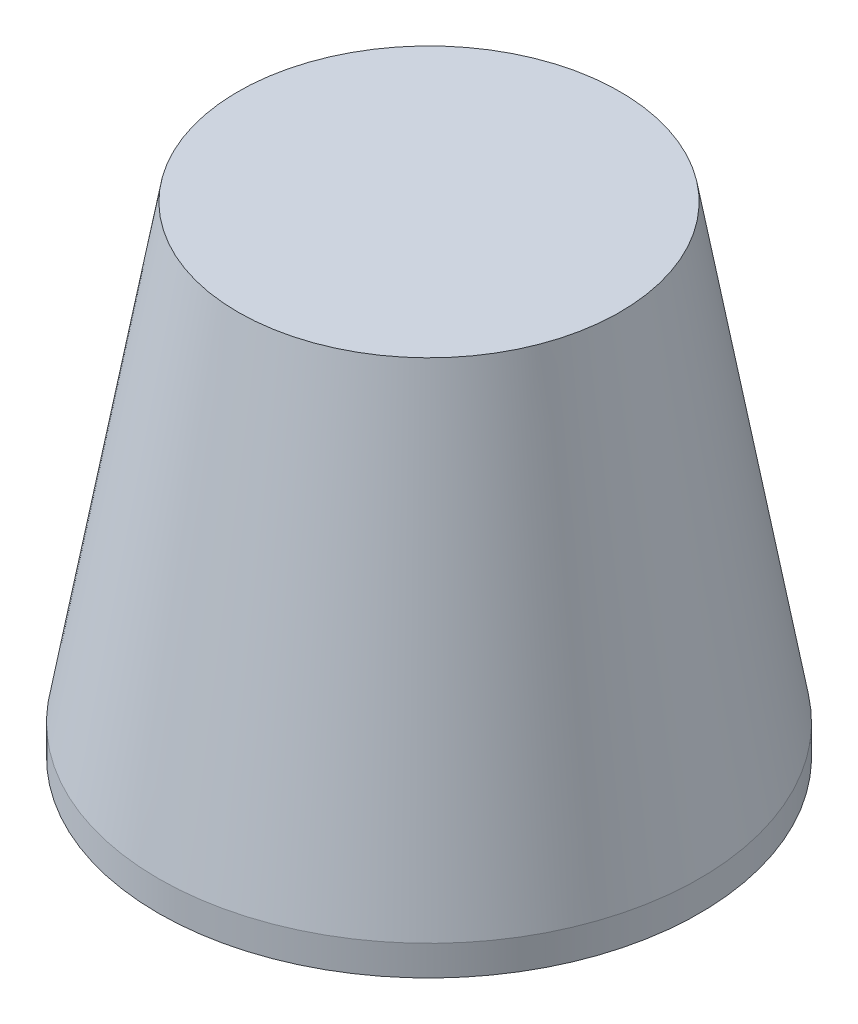
ISO-10303-21;
HEADER;
FILE_DESCRIPTION(('STEP AP214'),'2;1');
FILE_NAME('part.step','',(''),(''),'','','');
FILE_SCHEMA(('AUTOMOTIVE_DESIGN { 1 0 10303 214 1 1 1 1 }'));
ENDSEC;
DATA;
#1=APPLICATION_CONTEXT('core data for automotive mechanical design processes');
#2=APPLICATION_PROTOCOL_DEFINITION('international standard','automotive_design',2000,#1);
#3=PRODUCT_CONTEXT('',#1,'mechanical');
#4=PRODUCT('Part','Part','',(#3));
#5=PRODUCT_RELATED_PRODUCT_CATEGORY('part','',(#4));
#6=PRODUCT_DEFINITION_FORMATION('','',#4);
#7=PRODUCT_DEFINITION_CONTEXT('part definition',#1,'design');
#8=PRODUCT_DEFINITION('design','',#6,#7);
#9=PRODUCT_DEFINITION_SHAPE('','',#8);
#10=(LENGTH_UNIT() NAMED_UNIT(*) SI_UNIT(.MILLI.,.METRE.));
#11=(NAMED_UNIT(*) PLANE_ANGLE_UNIT() SI_UNIT($,.RADIAN.));
#12=(NAMED_UNIT(*) SI_UNIT($,.STERADIAN.) SOLID_ANGLE_UNIT());
#13=UNCERTAINTY_MEASURE_WITH_UNIT(LENGTH_MEASURE(1.E-05),#10,'distance_accuracy_value','');
#14=(GEOMETRIC_REPRESENTATION_CONTEXT(3) GLOBAL_UNCERTAINTY_ASSIGNED_CONTEXT((#13)) GLOBAL_UNIT_ASSIGNED_CONTEXT((#10,
#11,#12)) REPRESENTATION_CONTEXT('',''));
#15=CARTESIAN_POINT('',(0.,0.,0.));
#16=DIRECTION('',(0.,0.,1.));
#17=DIRECTION('',(1.,0.,0.));
#18=AXIS2_PLACEMENT_3D('',#15,#16,#17);
#19=CARTESIAN_POINT('',(0.,-6.,0.));
#20=DIRECTION('',(0.,1.,0.));
#21=DIRECTION('',(0.,0.,1.));
#22=AXIS2_PLACEMENT_3D('',#19,#20,#21);
#23=CYLINDRICAL_SURFACE('',#22,9.);
#24=CARTESIAN_POINT('',(0.,-5.00000000000026,0.));
#25=DIRECTION('',(0.,1.,0.));
#26=DIRECTION('',(0.,0.,1.));
#27=AXIS2_PLACEMENT_3D('',#24,#25,#26);
#28=CIRCLE('',#27,9.);
#29=CARTESIAN_POINT('',(0.,-5.00000000000026,9.));
#30=VERTEX_POINT('',#29);
#31=EDGE_CURVE('E10',#30,#30,#28,.F.);
#32=ORIENTED_EDGE('',*,*,#31,.T.);
#33=EDGE_LOOP('',(#32));
#34=FACE_BOUND('',#33,.T.);
#35=CARTESIAN_POINT('',(0.,-6.,0.));
#36=DIRECTION('',(0.,1.,0.));
#37=DIRECTION('',(0.,0.,1.));
#38=AXIS2_PLACEMENT_3D('',#35,#36,#37);
#39=CIRCLE('',#38,9.);
#40=CARTESIAN_POINT('',(0.,-6.,9.));
#41=VERTEX_POINT('',#40);
#42=EDGE_CURVE('E44',#41,#41,#39,.T.);
#43=ORIENTED_EDGE('',*,*,#42,.T.);
#44=EDGE_LOOP('',(#43));
#45=FACE_BOUND('',#44,.T.);
#46=ADVANCED_FACE('F33',(#34,#45),#23,.T.);
#47=CARTESIAN_POINT('',(0.,-6.,0.));
#48=DIRECTION('',(0.,1.,0.));
#49=DIRECTION('',(0.,0.,1.));
#50=AXIS2_PLACEMENT_3D('',#47,#48,#49);
#51=PLANE('',#50);
#52=ORIENTED_EDGE('',*,*,#42,.F.);
#53=EDGE_LOOP('',(#52));
#54=FACE_BOUND('',#53,.T.);
#55=ADVANCED_FACE('F52',(#54),#51,.F.);
#56=CARTESIAN_POINT('',(0.,10.,0.));
#57=DIRECTION('',(0.,1.,0.));
#58=DIRECTION('',(0.,0.,1.));
#59=AXIS2_PLACEMENT_3D('',#56,#57,#58);
#60=PLANE('',#59);
#61=CARTESIAN_POINT('',(0.,10.,0.));
#62=DIRECTION('',(0.,1.,0.));
#63=DIRECTION('',(0.,0.,1.));
#64=AXIS2_PLACEMENT_3D('',#61,#62,#63);
#65=CIRCLE('',#64,6.35509528937303);
#66=CARTESIAN_POINT('',(0.,10.,6.35509528937303));
#67=VERTEX_POINT('',#66);
#68=EDGE_CURVE('E40',#67,#67,#65,.T.);
#69=ORIENTED_EDGE('',*,*,#68,.T.);
#70=EDGE_LOOP('',(#69));
#71=FACE_BOUND('',#70,.T.);
#72=ADVANCED_FACE('F54',(#71),#60,.T.);
#73=CARTESIAN_POINT('',(0.,10.,0.));
#74=DIRECTION('',(0.,-1.,0.));
#75=DIRECTION('',(0.,0.,-1.));
#76=AXIS2_PLACEMENT_3D('',#73,#74,#75);
#77=CONICAL_SURFACE('',#76,6.35509528937303,0.17453292519943);
#78=ORIENTED_EDGE('',*,*,#31,.F.);
#79=EDGE_LOOP('',(#78));
#80=FACE_BOUND('',#79,.T.);
#81=ORIENTED_EDGE('',*,*,#68,.F.);
#82=EDGE_LOOP('',(#81));
#83=FACE_BOUND('',#82,.T.);
#84=ADVANCED_FACE('F35',(#80,#83),#77,.T.);
#85=CLOSED_SHELL('',(#46,#55,#72,#84));
#86=MANIFOLD_SOLID_BREP('B2',#85);
#87=ADVANCED_BREP_SHAPE_REPRESENTATION('',(#18,#86),#14);
#88=SHAPE_DEFINITION_REPRESENTATION(#9,#87);
ENDSEC;
END-ISO-10303-21;
